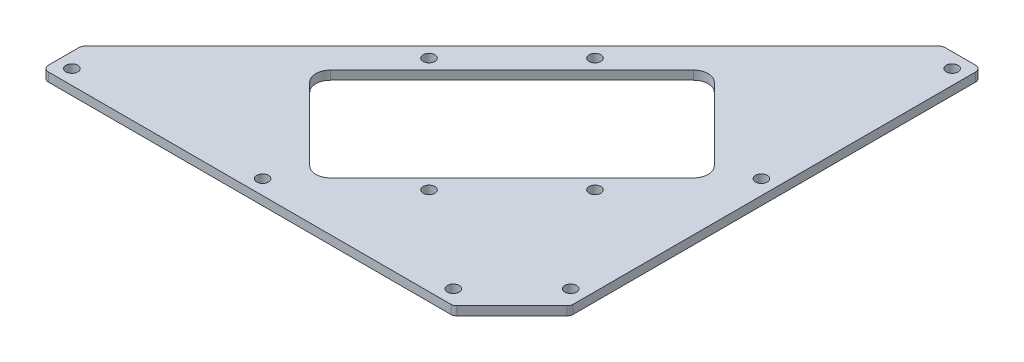
ISO-10303-21;
HEADER;
FILE_DESCRIPTION(('STEP AP214'),'2;1');
FILE_NAME('part.step','',(''),(''),'','','');
FILE_SCHEMA(('AUTOMOTIVE_DESIGN { 1 0 10303 214 1 1 1 1 }'));
ENDSEC;
DATA;
#1=APPLICATION_CONTEXT('core data for automotive mechanical design processes');
#2=APPLICATION_PROTOCOL_DEFINITION('international standard','automotive_design',2000,#1);
#3=PRODUCT_CONTEXT('',#1,'mechanical');
#4=PRODUCT('Part','Part','',(#3));
#5=PRODUCT_RELATED_PRODUCT_CATEGORY('part','',(#4));
#6=PRODUCT_DEFINITION_FORMATION('','',#4);
#7=PRODUCT_DEFINITION_CONTEXT('part definition',#1,'design');
#8=PRODUCT_DEFINITION('design','',#6,#7);
#9=PRODUCT_DEFINITION_SHAPE('','',#8);
#10=(LENGTH_UNIT() NAMED_UNIT(*) SI_UNIT(.MILLI.,.METRE.));
#11=(NAMED_UNIT(*) PLANE_ANGLE_UNIT() SI_UNIT($,.RADIAN.));
#12=(NAMED_UNIT(*) SI_UNIT($,.STERADIAN.) SOLID_ANGLE_UNIT());
#13=UNCERTAINTY_MEASURE_WITH_UNIT(LENGTH_MEASURE(1.E-05),#10,'distance_accuracy_value','');
#14=(GEOMETRIC_REPRESENTATION_CONTEXT(3) GLOBAL_UNCERTAINTY_ASSIGNED_CONTEXT((#13)) GLOBAL_UNIT_ASSIGNED_CONTEXT((#10,
#11,#12)) REPRESENTATION_CONTEXT('',''));
#15=CARTESIAN_POINT('',(0.,0.,0.));
#16=DIRECTION('',(0.,0.,1.));
#17=DIRECTION('',(1.,0.,0.));
#18=AXIS2_PLACEMENT_3D('',#15,#16,#17);
#19=CARTESIAN_POINT('',(-34.4714555828443,3.,34.4714555828442));
#20=DIRECTION('',(-0.707106781186548,0.,0.707106781186547));
#21=DIRECTION('',(0.707106781186547,0.,0.707106781186548));
#22=AXIS2_PLACEMENT_3D('',#19,#20,#21);
#23=PLANE('',#22);
#24=DIRECTION('',(-0.707106781186547,0.,-0.707106781186548));
#25=VECTOR('',#24,1.);
#26=CARTESIAN_POINT('',(-34.4714555828443,0.,34.4714555828442));
#27=LINE('',#26,#25);
#28=CARTESIAN_POINT('',(-85.7366972188688,0.,-16.7937860531805));
#29=VERTEX_POINT('',#28);
#30=CARTESIAN_POINT('',(-110.485434560398,0.,-41.5425233947097));
#31=VERTEX_POINT('',#30);
#32=EDGE_CURVE('E220',#29,#31,#27,.T.);
#33=ORIENTED_EDGE('',*,*,#32,.T.);
#34=DIRECTION('',(0.,-1.,0.));
#35=VECTOR('',#34,1.);
#36=CARTESIAN_POINT('',(-110.485434560398,3.,-41.5425233947097));
#37=LINE('',#36,#35);
#38=CARTESIAN_POINT('',(-110.485434560398,3.,-41.5425233947097));
#39=VERTEX_POINT('',#38);
#40=EDGE_CURVE('E306',#31,#39,#37,.F.);
#41=ORIENTED_EDGE('',*,*,#40,.T.);
#42=DIRECTION('',(-0.707106781186547,0.,-0.707106781186548));
#43=VECTOR('',#42,1.);
#44=CARTESIAN_POINT('',(-34.4714555828443,3.,34.4714555828442));
#45=LINE('',#44,#43);
#46=CARTESIAN_POINT('',(-85.7366972188688,3.,-16.7937860531805));
#47=VERTEX_POINT('',#46);
#48=EDGE_CURVE('E348',#47,#39,#45,.T.);
#49=ORIENTED_EDGE('',*,*,#48,.F.);
#50=DIRECTION('',(0.,-1.,0.));
#51=VECTOR('',#50,1.);
#52=CARTESIAN_POINT('',(-85.7366972188688,3.,-16.7937860531805));
#53=LINE('',#52,#51);
#54=EDGE_CURVE('E303',#47,#29,#53,.T.);
#55=ORIENTED_EDGE('',*,*,#54,.T.);
#56=EDGE_LOOP('',(#33,#41,#49,#55));
#57=FACE_BOUND('',#56,.T.);
#58=ADVANCED_FACE('F37',(#57),#23,.F.);
#59=CARTESIAN_POINT('',(-79.5495128834866,3.,-79.5495128834866));
#60=DIRECTION('',(-0.707106781186548,0.,-0.707106781186547));
#61=DIRECTION('',(-0.707106781186547,0.,0.707106781186548));
#62=AXIS2_PLACEMENT_3D('',#59,#60,#61);
#63=PLANE('',#62);
#64=DIRECTION('',(0.707106781186547,0.,-0.707106781186548));
#65=VECTOR('',#64,1.);
#66=CARTESIAN_POINT('',(-79.5495128834866,3.,-79.5495128834866));
#67=LINE('',#66,#65);
#68=CARTESIAN_POINT('',(-110.485434560398,3.,-48.6135912065752));
#69=VERTEX_POINT('',#68);
#70=CARTESIAN_POINT('',(-48.6135912065751,3.,-110.485434560398));
#71=VERTEX_POINT('',#70);
#72=EDGE_CURVE('E343',#69,#71,#67,.T.);
#73=ORIENTED_EDGE('',*,*,#72,.F.);
#74=DIRECTION('',(0.,-1.,0.));
#75=VECTOR('',#74,1.);
#76=CARTESIAN_POINT('',(-110.485434560398,0.,-48.6135912065752));
#77=LINE('',#76,#75);
#78=CARTESIAN_POINT('',(-110.485434560398,0.,-48.6135912065752));
#79=VERTEX_POINT('',#78);
#80=EDGE_CURVE('E300',#69,#79,#77,.T.);
#81=ORIENTED_EDGE('',*,*,#80,.T.);
#82=DIRECTION('',(0.707106781186547,0.,-0.707106781186548));
#83=VECTOR('',#82,1.);
#84=CARTESIAN_POINT('',(-79.5495128834866,0.,-79.5495128834866));
#85=LINE('',#84,#83);
#86=CARTESIAN_POINT('',(-48.6135912065751,0.,-110.485434560398));
#87=VERTEX_POINT('',#86);
#88=EDGE_CURVE('E223',#79,#87,#85,.T.);
#89=ORIENTED_EDGE('',*,*,#88,.T.);
#90=DIRECTION('',(0.,-1.,0.));
#91=VECTOR('',#90,1.);
#92=CARTESIAN_POINT('',(-48.6135912065751,3.,-110.485434560398));
#93=LINE('',#92,#91);
#94=EDGE_CURVE('E298',#87,#71,#93,.F.);
#95=ORIENTED_EDGE('',*,*,#94,.T.);
#96=EDGE_LOOP('',(#73,#81,#89,#95));
#97=FACE_BOUND('',#96,.T.);
#98=ADVANCED_FACE('F337',(#97),#63,.F.);
#99=CARTESIAN_POINT('',(34.4714555828442,3.,-34.4714555828443));
#100=DIRECTION('',(-0.707106781186547,0.,0.707106781186548));
#101=DIRECTION('',(0.707106781186548,0.,0.707106781186547));
#102=AXIS2_PLACEMENT_3D('',#99,#100,#101);
#103=PLANE('',#102);
#104=DIRECTION('',(-0.707106781186548,0.,-0.707106781186547));
#105=VECTOR('',#104,1.);
#106=CARTESIAN_POINT('',(34.4714555828442,0.,-34.4714555828443));
#107=LINE('',#106,#105);
#108=CARTESIAN_POINT('',(-16.7937860531805,0.,-85.7366972188689));
#109=VERTEX_POINT('',#108);
#110=CARTESIAN_POINT('',(-41.5425233947096,0.,-110.485434560398));
#111=VERTEX_POINT('',#110);
#112=EDGE_CURVE('E226',#109,#111,#107,.T.);
#113=ORIENTED_EDGE('',*,*,#112,.F.);
#114=DIRECTION('',(0.,-1.,0.));
#115=VECTOR('',#114,1.);
#116=CARTESIAN_POINT('',(-16.7937860531805,3.,-85.7366972188689));
#117=LINE('',#116,#115);
#118=CARTESIAN_POINT('',(-16.7937860531805,3.,-85.7366972188689));
#119=VERTEX_POINT('',#118);
#120=EDGE_CURVE('E57',#109,#119,#117,.F.);
#121=ORIENTED_EDGE('',*,*,#120,.T.);
#122=DIRECTION('',(-0.707106781186548,0.,-0.707106781186547));
#123=VECTOR('',#122,1.);
#124=CARTESIAN_POINT('',(34.4714555828442,3.,-34.4714555828443));
#125=LINE('',#124,#123);
#126=CARTESIAN_POINT('',(-41.5425233947096,3.,-110.485434560398));
#127=VERTEX_POINT('',#126);
#128=EDGE_CURVE('E340',#119,#127,#125,.T.);
#129=ORIENTED_EDGE('',*,*,#128,.T.);
#130=DIRECTION('',(0.,-1.,0.));
#131=VECTOR('',#130,1.);
#132=CARTESIAN_POINT('',(-41.5425233947096,3.,-110.485434560398));
#133=LINE('',#132,#131);
#134=EDGE_CURVE('E313',#127,#111,#133,.T.);
#135=ORIENTED_EDGE('',*,*,#134,.T.);
#136=EDGE_LOOP('',(#113,#121,#129,#135));
#137=FACE_BOUND('',#136,.T.);
#138=ADVANCED_FACE('F339',(#137),#103,.T.);
#139=CARTESIAN_POINT('',(-86.620580695352,3.,-86.620580695352));
#140=DIRECTION('',(-0.707106781186547,0.,-0.707106781186547));
#141=DIRECTION('',(-0.707106781186548,0.,0.707106781186548));
#142=AXIS2_PLACEMENT_3D('',#139,#140,#141);
#143=PLANE('',#142);
#144=DIRECTION('',(0.707106781186548,0.,-0.707106781186548));
#145=VECTOR('',#144,1.);
#146=CARTESIAN_POINT('',(-86.620580695352,3.,-86.620580695352));
#147=LINE('',#146,#145);
#148=CARTESIAN_POINT('',(-159.414213562373,3.,-13.826947828331));
#149=VERTEX_POINT('',#148);
#150=CARTESIAN_POINT('',(-13.826947828331,3.,-159.414213562373));
#151=VERTEX_POINT('',#150);
#152=EDGE_CURVE('E253',#149,#151,#147,.T.);
#153=ORIENTED_EDGE('',*,*,#152,.T.);
#154=DIRECTION('',(0.,-1.,0.));
#155=VECTOR('',#154,1.);
#156=CARTESIAN_POINT('',(-13.826947828331,0.,-159.414213562373));
#157=LINE('',#156,#155);
#158=CARTESIAN_POINT('',(-13.826947828331,0.,-159.414213562373));
#159=VERTEX_POINT('',#158);
#160=EDGE_CURVE('E285',#151,#159,#157,.T.);
#161=ORIENTED_EDGE('',*,*,#160,.T.);
#162=DIRECTION('',(0.707106781186548,0.,-0.707106781186548));
#163=VECTOR('',#162,1.);
#164=CARTESIAN_POINT('',(-86.620580695352,0.,-86.620580695352));
#165=LINE('',#164,#163);
#166=CARTESIAN_POINT('',(-159.414213562373,0.,-13.826947828331));
#167=VERTEX_POINT('',#166);
#168=EDGE_CURVE('E371',#167,#159,#165,.T.);
#169=ORIENTED_EDGE('',*,*,#168,.F.);
#170=DIRECTION('',(0.,-1.,0.));
#171=VECTOR('',#170,1.);
#172=CARTESIAN_POINT('',(-159.414213562373,3.,-13.826947828331));
#173=LINE('',#172,#171);
#174=EDGE_CURVE('E283',#167,#149,#173,.F.);
#175=ORIENTED_EDGE('',*,*,#174,.T.);
#176=EDGE_LOOP('',(#153,#161,#169,#175));
#177=FACE_BOUND('',#176,.T.);
#178=ADVANCED_FACE('F475',(#177),#143,.T.);
#179=CARTESIAN_POINT('',(-160.,3.,0.));
#180=DIRECTION('',(-1.,0.,0.));
#181=DIRECTION('',(0.,0.,1.));
#182=AXIS2_PLACEMENT_3D('',#179,#180,#181);
#183=PLANE('',#182);
#184=DIRECTION('',(0.,0.,-1.));
#185=VECTOR('',#184,1.);
#186=CARTESIAN_POINT('',(-160.,0.,0.));
#187=LINE('',#186,#185);
#188=CARTESIAN_POINT('',(-160.,0.,-2.00000000000006));
#189=VERTEX_POINT('',#188);
#190=CARTESIAN_POINT('',(-160.,0.,-12.4127342659579));
#191=VERTEX_POINT('',#190);
#192=EDGE_CURVE('E374',#189,#191,#187,.T.);
#193=ORIENTED_EDGE('',*,*,#192,.F.);
#194=DIRECTION('',(0.,-1.,0.));
#195=VECTOR('',#194,1.);
#196=CARTESIAN_POINT('',(-160.,3.,-2.00000000000006));
#197=LINE('',#196,#195);
#198=CARTESIAN_POINT('',(-160.,3.,-2.00000000000006));
#199=VERTEX_POINT('',#198);
#200=EDGE_CURVE('E296',#189,#199,#197,.F.);
#201=ORIENTED_EDGE('',*,*,#200,.T.);
#202=DIRECTION('',(0.,0.,-1.));
#203=VECTOR('',#202,1.);
#204=CARTESIAN_POINT('',(-160.,3.,0.));
#205=LINE('',#204,#203);
#206=CARTESIAN_POINT('',(-160.,3.,-12.4127342659579));
#207=VERTEX_POINT('',#206);
#208=EDGE_CURVE('E400',#199,#207,#205,.T.);
#209=ORIENTED_EDGE('',*,*,#208,.T.);
#210=DIRECTION('',(0.,-1.,0.));
#211=VECTOR('',#210,1.);
#212=CARTESIAN_POINT('',(-160.,3.,-12.4127342659579));
#213=LINE('',#212,#211);
#214=EDGE_CURVE('E293',#207,#191,#213,.T.);
#215=ORIENTED_EDGE('',*,*,#214,.T.);
#216=EDGE_LOOP('',(#193,#201,#209,#215));
#217=FACE_BOUND('',#216,.T.);
#218=ADVANCED_FACE('F472',(#217),#183,.T.);
#219=CARTESIAN_POINT('',(0.,3.,0.));
#220=DIRECTION('',(0.,0.,-1.));
#221=DIRECTION('',(-1.,0.,0.));
#222=AXIS2_PLACEMENT_3D('',#219,#220,#221);
#223=PLANE('',#222);
#224=DIRECTION('',(1.,0.,0.));
#225=VECTOR('',#224,1.);
#226=CARTESIAN_POINT('',(0.,0.,0.));
#227=LINE('',#226,#225);
#228=CARTESIAN_POINT('',(-158.,0.,0.));
#229=VERTEX_POINT('',#228);
#230=CARTESIAN_POINT('',(-20.8284271247462,0.,0.));
#231=VERTEX_POINT('',#230);
#232=EDGE_CURVE('E208',#229,#231,#227,.T.);
#233=ORIENTED_EDGE('',*,*,#232,.T.);
#234=DIRECTION('',(0.,-1.,0.));
#235=VECTOR('',#234,1.);
#236=CARTESIAN_POINT('',(-20.8284271247462,3.,0.));
#237=LINE('',#236,#235);
#238=CARTESIAN_POINT('',(-20.8284271247462,3.,0.));
#239=VERTEX_POINT('',#238);
#240=EDGE_CURVE('E281',#231,#239,#237,.F.);
#241=ORIENTED_EDGE('',*,*,#240,.T.);
#242=DIRECTION('',(1.,0.,0.));
#243=VECTOR('',#242,1.);
#244=CARTESIAN_POINT('',(0.,3.,0.));
#245=LINE('',#244,#243);
#246=CARTESIAN_POINT('',(-158.,3.,0.));
#247=VERTEX_POINT('',#246);
#248=EDGE_CURVE('E394',#247,#239,#245,.T.);
#249=ORIENTED_EDGE('',*,*,#248,.F.);
#250=DIRECTION('',(0.,-1.,0.));
#251=VECTOR('',#250,1.);
#252=CARTESIAN_POINT('',(-158.,0.,0.));
#253=LINE('',#252,#251);
#254=EDGE_CURVE('E278',#247,#229,#253,.T.);
#255=ORIENTED_EDGE('',*,*,#254,.T.);
#256=EDGE_LOOP('',(#233,#241,#249,#255));
#257=FACE_BOUND('',#256,.T.);
#258=ADVANCED_FACE('F380',(#257),#223,.F.);
#259=CARTESIAN_POINT('',(-10.,3.,-10.));
#260=DIRECTION('',(-0.707106781186547,0.,-0.707106781186547));
#261=DIRECTION('',(-0.707106781186548,0.,0.707106781186548));
#262=AXIS2_PLACEMENT_3D('',#259,#260,#261);
#263=PLANE('',#262);
#264=DIRECTION('',(0.707106781186548,0.,-0.707106781186548));
#265=VECTOR('',#264,1.);
#266=CARTESIAN_POINT('',(-10.,0.,-10.));
#267=LINE('',#266,#265);
#268=CARTESIAN_POINT('',(-19.4142135623731,0.,-0.585786437626914));
#269=VERTEX_POINT('',#268);
#270=CARTESIAN_POINT('',(-0.585786437626907,0.,-19.4142135623731));
#271=VERTEX_POINT('',#270);
#272=EDGE_CURVE('E203',#269,#271,#267,.T.);
#273=ORIENTED_EDGE('',*,*,#272,.T.);
#274=DIRECTION('',(0.,-1.,0.));
#275=VECTOR('',#274,1.);
#276=CARTESIAN_POINT('',(-0.585786437626908,3.,-19.4142135623731));
#277=LINE('',#276,#275);
#278=CARTESIAN_POINT('',(-0.585786437626907,3.,-19.4142135623731));
#279=VERTEX_POINT('',#278);
#280=EDGE_CURVE('E179',#271,#279,#277,.F.);
#281=ORIENTED_EDGE('',*,*,#280,.T.);
#282=DIRECTION('',(0.707106781186548,0.,-0.707106781186548));
#283=VECTOR('',#282,1.);
#284=CARTESIAN_POINT('',(-10.,3.,-10.));
#285=LINE('',#284,#283);
#286=CARTESIAN_POINT('',(-19.4142135623731,3.,-0.585786437626914));
#287=VERTEX_POINT('',#286);
#288=EDGE_CURVE('E393',#287,#279,#285,.T.);
#289=ORIENTED_EDGE('',*,*,#288,.F.);
#290=DIRECTION('',(0.,-1.,0.));
#291=VECTOR('',#290,1.);
#292=CARTESIAN_POINT('',(-19.4142135623731,3.,-0.585786437626915));
#293=LINE('',#292,#291);
#294=EDGE_CURVE('E184',#287,#269,#293,.T.);
#295=ORIENTED_EDGE('',*,*,#294,.T.);
#296=EDGE_LOOP('',(#273,#281,#289,#295));
#297=FACE_BOUND('',#296,.T.);
#298=ADVANCED_FACE('F396',(#297),#263,.F.);
#299=CARTESIAN_POINT('',(0.,3.,0.));
#300=DIRECTION('',(-1.,0.,0.));
#301=DIRECTION('',(0.,0.,1.));
#302=AXIS2_PLACEMENT_3D('',#299,#300,#301);
#303=PLANE('',#302);
#304=DIRECTION('',(0.,0.,-1.));
#305=VECTOR('',#304,1.);
#306=CARTESIAN_POINT('',(0.,3.,0.));
#307=LINE('',#306,#305);
#308=CARTESIAN_POINT('',(0.,3.,-20.8284271247462));
#309=VERTEX_POINT('',#308);
#310=CARTESIAN_POINT('',(0.,3.,-158.));
#311=VERTEX_POINT('',#310);
#312=EDGE_CURVE('E194',#309,#311,#307,.T.);
#313=ORIENTED_EDGE('',*,*,#312,.F.);
#314=DIRECTION('',(0.,-1.,0.));
#315=VECTOR('',#314,1.);
#316=CARTESIAN_POINT('',(0.,3.,-20.8284271247462));
#317=LINE('',#316,#315);
#318=CARTESIAN_POINT('',(0.,0.,-20.8284271247462));
#319=VERTEX_POINT('',#318);
#320=EDGE_CURVE('E178',#309,#319,#317,.T.);
#321=ORIENTED_EDGE('',*,*,#320,.T.);
#322=DIRECTION('',(0.,0.,-1.));
#323=VECTOR('',#322,1.);
#324=CARTESIAN_POINT('',(0.,0.,0.));
#325=LINE('',#324,#323);
#326=CARTESIAN_POINT('',(0.,0.,-158.));
#327=VERTEX_POINT('',#326);
#328=EDGE_CURVE('E191',#319,#327,#325,.T.);
#329=ORIENTED_EDGE('',*,*,#328,.T.);
#330=DIRECTION('',(0.,-1.,0.));
#331=VECTOR('',#330,1.);
#332=CARTESIAN_POINT('',(0.,3.,-158.));
#333=LINE('',#332,#331);
#334=EDGE_CURVE('E196',#327,#311,#333,.F.);
#335=ORIENTED_EDGE('',*,*,#334,.T.);
#336=EDGE_LOOP('',(#313,#321,#329,#335));
#337=FACE_BOUND('',#336,.T.);
#338=ADVANCED_FACE('F190',(#337),#303,.F.);
#339=CARTESIAN_POINT('',(-5.,3.,-155.));
#340=DIRECTION('',(0.,-1.,0.));
#341=DIRECTION('',(0.,0.,-1.));
#342=AXIS2_PLACEMENT_3D('',#339,#340,#341);
#343=CYLINDRICAL_SURFACE('',#342,2.);
#344=CARTESIAN_POINT('',(-5.,3.,-155.));
#345=DIRECTION('',(0.,1.,0.));
#346=DIRECTION('',(0.,0.,1.));
#347=AXIS2_PLACEMENT_3D('',#344,#345,#346);
#348=CIRCLE('',#347,2.);
#349=CARTESIAN_POINT('',(-5.,3.,-153.));
#350=VERTEX_POINT('',#349);
#351=EDGE_CURVE('E366',#350,#350,#348,.T.);
#352=ORIENTED_EDGE('',*,*,#351,.T.);
#353=EDGE_LOOP('',(#352));
#354=FACE_BOUND('',#353,.T.);
#355=CARTESIAN_POINT('',(-5.,0.,-155.));
#356=DIRECTION('',(0.,1.,0.));
#357=DIRECTION('',(0.,0.,1.));
#358=AXIS2_PLACEMENT_3D('',#355,#356,#357);
#359=CIRCLE('',#358,2.);
#360=CARTESIAN_POINT('',(-5.,0.,-153.));
#361=VERTEX_POINT('',#360);
#362=EDGE_CURVE('E247',#361,#361,#359,.T.);
#363=ORIENTED_EDGE('',*,*,#362,.F.);
#364=EDGE_LOOP('',(#363));
#365=FACE_BOUND('',#364,.T.);
#366=ADVANCED_FACE('F467',(#354,#365),#343,.F.);
#367=CARTESIAN_POINT('',(-30.0520382004283,3.,-58.3363094478902));
#368=DIRECTION('',(0.,-1.,0.));
#369=DIRECTION('',(0.,0.,-1.));
#370=AXIS2_PLACEMENT_3D('',#367,#368,#369);
#371=CYLINDRICAL_SURFACE('',#370,2.);
#372=CARTESIAN_POINT('',(-30.0520382004283,3.,-58.3363094478902));
#373=DIRECTION('',(0.,1.,0.));
#374=DIRECTION('',(0.,0.,1.));
#375=AXIS2_PLACEMENT_3D('',#372,#373,#374);
#376=CIRCLE('',#375,2.);
#377=CARTESIAN_POINT('',(-30.0520382004283,3.,-56.3363094478902));
#378=VERTEX_POINT('',#377);
#379=EDGE_CURVE('E363',#378,#378,#376,.F.);
#380=ORIENTED_EDGE('',*,*,#379,.F.);
#381=EDGE_LOOP('',(#380));
#382=FACE_BOUND('',#381,.T.);
#383=CARTESIAN_POINT('',(-30.0520382004283,0.,-58.3363094478902));
#384=DIRECTION('',(0.,1.,0.));
#385=DIRECTION('',(0.,0.,1.));
#386=AXIS2_PLACEMENT_3D('',#383,#384,#385);
#387=CIRCLE('',#386,2.);
#388=CARTESIAN_POINT('',(-30.0520382004283,0.,-56.3363094478902));
#389=VERTEX_POINT('',#388);
#390=EDGE_CURVE('E244',#389,#389,#387,.F.);
#391=ORIENTED_EDGE('',*,*,#390,.T.);
#392=EDGE_LOOP('',(#391));
#393=FACE_BOUND('',#392,.T.);
#394=ADVANCED_FACE('F703',(#382,#393),#371,.F.);
#395=CARTESIAN_POINT('',(-68.9429111656884,3.,-97.2271824131503));
#396=DIRECTION('',(0.,-1.,0.));
#397=DIRECTION('',(0.,0.,-1.));
#398=AXIS2_PLACEMENT_3D('',#395,#396,#397);
#399=CYLINDRICAL_SURFACE('',#398,2.);
#400=CARTESIAN_POINT('',(-68.9429111656884,3.,-97.2271824131503));
#401=DIRECTION('',(0.,1.,0.));
#402=DIRECTION('',(0.,0.,1.));
#403=AXIS2_PLACEMENT_3D('',#400,#401,#402);
#404=CIRCLE('',#403,2.);
#405=CARTESIAN_POINT('',(-68.9429111656884,3.,-95.2271824131503));
#406=VERTEX_POINT('',#405);
#407=EDGE_CURVE('E360',#406,#406,#404,.T.);
#408=ORIENTED_EDGE('',*,*,#407,.T.);
#409=EDGE_LOOP('',(#408));
#410=FACE_BOUND('',#409,.T.);
#411=CARTESIAN_POINT('',(-68.9429111656884,0.,-97.2271824131503));
#412=DIRECTION('',(0.,1.,0.));
#413=DIRECTION('',(0.,0.,1.));
#414=AXIS2_PLACEMENT_3D('',#411,#412,#413);
#415=CIRCLE('',#414,2.);
#416=CARTESIAN_POINT('',(-68.9429111656884,0.,-95.2271824131503));
#417=VERTEX_POINT('',#416);
#418=EDGE_CURVE('E241',#417,#417,#415,.T.);
#419=ORIENTED_EDGE('',*,*,#418,.F.);
#420=EDGE_LOOP('',(#419));
#421=FACE_BOUND('',#420,.T.);
#422=ADVANCED_FACE('F693',(#410,#421),#399,.F.);
#423=CARTESIAN_POINT('',(-90.,3.,-5.00000000000002));
#424=DIRECTION('',(0.,-1.,0.));
#425=DIRECTION('',(0.,0.,-1.));
#426=AXIS2_PLACEMENT_3D('',#423,#424,#425);
#427=CYLINDRICAL_SURFACE('',#426,2.);
#428=CARTESIAN_POINT('',(-90.,3.,-5.00000000000002));
#429=DIRECTION('',(0.,1.,0.));
#430=DIRECTION('',(0.,0.,1.));
#431=AXIS2_PLACEMENT_3D('',#428,#429,#430);
#432=CIRCLE('',#431,2.);
#433=CARTESIAN_POINT('',(-90.,3.,-3.00000000000002));
#434=VERTEX_POINT('',#433);
#435=EDGE_CURVE('E357',#434,#434,#432,.F.);
#436=ORIENTED_EDGE('',*,*,#435,.F.);
#437=EDGE_LOOP('',(#436));
#438=FACE_BOUND('',#437,.T.);
#439=CARTESIAN_POINT('',(-90.,0.,-5.00000000000002));
#440=DIRECTION('',(0.,1.,0.));
#441=DIRECTION('',(0.,0.,1.));
#442=AXIS2_PLACEMENT_3D('',#439,#440,#441);
#443=CIRCLE('',#442,2.);
#444=CARTESIAN_POINT('',(-90.,0.,-3.00000000000002));
#445=VERTEX_POINT('',#444);
#446=EDGE_CURVE('E238',#445,#445,#443,.F.);
#447=ORIENTED_EDGE('',*,*,#446,.T.);
#448=EDGE_LOOP('',(#447));
#449=FACE_BOUND('',#448,.T.);
#450=ADVANCED_FACE('F683',(#438,#449),#427,.F.);
#451=CARTESIAN_POINT('',(-5.,3.,-90.));
#452=DIRECTION('',(0.,-1.,0.));
#453=DIRECTION('',(0.,0.,-1.));
#454=AXIS2_PLACEMENT_3D('',#451,#452,#453);
#455=CYLINDRICAL_SURFACE('',#454,2.);
#456=CARTESIAN_POINT('',(-5.,3.,-90.));
#457=DIRECTION('',(0.,1.,0.));
#458=DIRECTION('',(0.,0.,1.));
#459=AXIS2_PLACEMENT_3D('',#456,#457,#458);
#460=CIRCLE('',#459,2.);
#461=CARTESIAN_POINT('',(-5.,3.,-88.));
#462=VERTEX_POINT('',#461);
#463=EDGE_CURVE('E354',#462,#462,#460,.T.);
#464=ORIENTED_EDGE('',*,*,#463,.T.);
#465=EDGE_LOOP('',(#464));
#466=FACE_BOUND('',#465,.T.);
#467=CARTESIAN_POINT('',(-5.,0.,-90.));
#468=DIRECTION('',(0.,1.,0.));
#469=DIRECTION('',(0.,0.,1.));
#470=AXIS2_PLACEMENT_3D('',#467,#468,#469);
#471=CIRCLE('',#470,2.);
#472=CARTESIAN_POINT('',(-5.,0.,-88.));
#473=VERTEX_POINT('',#472);
#474=EDGE_CURVE('E235',#473,#473,#471,.T.);
#475=ORIENTED_EDGE('',*,*,#474,.F.);
#476=EDGE_LOOP('',(#475));
#477=FACE_BOUND('',#476,.T.);
#478=ADVANCED_FACE('F675',(#466,#477),#455,.F.);
#479=CARTESIAN_POINT('',(-5.,3.,-25.));
#480=DIRECTION('',(0.,-1.,0.));
#481=DIRECTION('',(0.,0.,-1.));
#482=AXIS2_PLACEMENT_3D('',#479,#480,#481);
#483=CYLINDRICAL_SURFACE('',#482,2.);
#484=CARTESIAN_POINT('',(-5.,3.,-25.));
#485=DIRECTION('',(0.,1.,0.));
#486=DIRECTION('',(0.,0.,1.));
#487=AXIS2_PLACEMENT_3D('',#484,#485,#486);
#488=CIRCLE('',#487,2.);
#489=CARTESIAN_POINT('',(-5.,3.,-23.));
#490=VERTEX_POINT('',#489);
#491=EDGE_CURVE('E346',#490,#490,#488,.T.);
#492=ORIENTED_EDGE('',*,*,#491,.T.);
#493=EDGE_LOOP('',(#492));
#494=FACE_BOUND('',#493,.T.);
#495=CARTESIAN_POINT('',(-5.,0.,-25.));
#496=DIRECTION('',(0.,1.,0.));
#497=DIRECTION('',(0.,0.,1.));
#498=AXIS2_PLACEMENT_3D('',#495,#496,#497);
#499=CIRCLE('',#498,2.);
#500=CARTESIAN_POINT('',(-5.,0.,-23.));
#501=VERTEX_POINT('',#500);
#502=EDGE_CURVE('E232',#501,#501,#499,.T.);
#503=ORIENTED_EDGE('',*,*,#502,.F.);
#504=EDGE_LOOP('',(#503));
#505=FACE_BOUND('',#504,.T.);
#506=ADVANCED_FACE('F647',(#494,#505),#483,.F.);
#507=CARTESIAN_POINT('',(-47.7297077300919,3.,-47.7297077300919));
#508=DIRECTION('',(-0.707106781186548,0.,-0.707106781186547));
#509=DIRECTION('',(-0.707106781186547,0.,0.707106781186548));
#510=AXIS2_PLACEMENT_3D('',#507,#508,#509);
#511=PLANE('',#510);
#512=DIRECTION('',(0.707106781186547,0.,-0.707106781186548));
#513=VECTOR('',#512,1.);
#514=CARTESIAN_POINT('',(-47.7297077300919,0.,-47.7297077300919));
#515=LINE('',#514,#513);
#516=CARTESIAN_POINT('',(-78.6656294070034,0.,-16.7937860531805));
#517=VERTEX_POINT('',#516);
#518=CARTESIAN_POINT('',(-16.7937860531805,0.,-78.6656294070034));
#519=VERTEX_POINT('',#518);
#520=EDGE_CURVE('E229',#517,#519,#515,.T.);
#521=ORIENTED_EDGE('',*,*,#520,.F.);
#522=DIRECTION('',(0.,-1.,0.));
#523=VECTOR('',#522,1.);
#524=CARTESIAN_POINT('',(-78.6656294070034,3.,-16.7937860531805));
#525=LINE('',#524,#523);
#526=CARTESIAN_POINT('',(-78.6656294070034,3.,-16.7937860531805));
#527=VERTEX_POINT('',#526);
#528=EDGE_CURVE('E311',#517,#527,#525,.F.);
#529=ORIENTED_EDGE('',*,*,#528,.T.);
#530=DIRECTION('',(0.707106781186547,0.,-0.707106781186548));
#531=VECTOR('',#530,1.);
#532=CARTESIAN_POINT('',(-47.7297077300919,3.,-47.7297077300919));
#533=LINE('',#532,#531);
#534=CARTESIAN_POINT('',(-16.7937860531805,3.,-78.6656294070034));
#535=VERTEX_POINT('',#534);
#536=EDGE_CURVE('E342',#527,#535,#533,.T.);
#537=ORIENTED_EDGE('',*,*,#536,.T.);
#538=DIRECTION('',(0.,-1.,0.));
#539=VECTOR('',#538,1.);
#540=CARTESIAN_POINT('',(-16.7937860531805,0.,-78.6656294070034));
#541=LINE('',#540,#539);
#542=EDGE_CURVE('E308',#535,#519,#541,.T.);
#543=ORIENTED_EDGE('',*,*,#542,.T.);
#544=EDGE_LOOP('',(#521,#529,#537,#543));
#545=FACE_BOUND('',#544,.T.);
#546=ADVANCED_FACE('F430',(#545),#511,.T.);
#547=CARTESIAN_POINT('',(-25.,3.,-5.));
#548=DIRECTION('',(0.,-1.,0.));
#549=DIRECTION('',(0.,0.,-1.));
#550=AXIS2_PLACEMENT_3D('',#547,#548,#549);
#551=CYLINDRICAL_SURFACE('',#550,2.);
#552=CARTESIAN_POINT('',(-25.,3.,-5.));
#553=DIRECTION('',(0.,1.,0.));
#554=DIRECTION('',(0.,0.,1.));
#555=AXIS2_PLACEMENT_3D('',#552,#553,#554);
#556=CIRCLE('',#555,2.);
#557=CARTESIAN_POINT('',(-25.,3.,-3.));
#558=VERTEX_POINT('',#557);
#559=EDGE_CURVE('E412',#558,#558,#556,.F.);
#560=ORIENTED_EDGE('',*,*,#559,.F.);
#561=EDGE_LOOP('',(#560));
#562=FACE_BOUND('',#561,.T.);
#563=CARTESIAN_POINT('',(-25.,0.,-5.));
#564=DIRECTION('',(0.,1.,0.));
#565=DIRECTION('',(0.,0.,1.));
#566=AXIS2_PLACEMENT_3D('',#563,#564,#565);
#567=CIRCLE('',#566,2.);
#568=CARTESIAN_POINT('',(-25.,0.,-3.));
#569=VERTEX_POINT('',#568);
#570=EDGE_CURVE('E217',#569,#569,#567,.F.);
#571=ORIENTED_EDGE('',*,*,#570,.T.);
#572=EDGE_LOOP('',(#571));
#573=FACE_BOUND('',#572,.T.);
#574=ADVANCED_FACE('F448',(#562,#573),#551,.F.);
#575=CARTESIAN_POINT('',(-58.3363094478902,3.,-30.0520382004283));
#576=DIRECTION('',(0.,-1.,0.));
#577=DIRECTION('',(0.,0.,-1.));
#578=AXIS2_PLACEMENT_3D('',#575,#576,#577);
#579=CYLINDRICAL_SURFACE('',#578,2.);
#580=CARTESIAN_POINT('',(-58.3363094478902,3.,-30.0520382004283));
#581=DIRECTION('',(0.,1.,0.));
#582=DIRECTION('',(0.,0.,1.));
#583=AXIS2_PLACEMENT_3D('',#580,#581,#582);
#584=CIRCLE('',#583,2.);
#585=CARTESIAN_POINT('',(-58.3363094478902,3.,-28.0520382004283));
#586=VERTEX_POINT('',#585);
#587=EDGE_CURVE('E409',#586,#586,#584,.T.);
#588=ORIENTED_EDGE('',*,*,#587,.T.);
#589=EDGE_LOOP('',(#588));
#590=FACE_BOUND('',#589,.T.);
#591=CARTESIAN_POINT('',(-58.3363094478902,0.,-30.0520382004283));
#592=DIRECTION('',(0.,1.,0.));
#593=DIRECTION('',(0.,0.,1.));
#594=AXIS2_PLACEMENT_3D('',#591,#592,#593);
#595=CIRCLE('',#594,2.);
#596=CARTESIAN_POINT('',(-58.3363094478902,0.,-28.0520382004283));
#597=VERTEX_POINT('',#596);
#598=EDGE_CURVE('E214',#597,#597,#595,.T.);
#599=ORIENTED_EDGE('',*,*,#598,.F.);
#600=EDGE_LOOP('',(#599));
#601=FACE_BOUND('',#600,.T.);
#602=ADVANCED_FACE('F451',(#590,#601),#579,.F.);
#603=CARTESIAN_POINT('',(-97.2271824131503,3.,-68.9429111656884));
#604=DIRECTION('',(0.,-1.,0.));
#605=DIRECTION('',(0.,0.,-1.));
#606=AXIS2_PLACEMENT_3D('',#603,#604,#605);
#607=CYLINDRICAL_SURFACE('',#606,2.);
#608=CARTESIAN_POINT('',(-97.2271824131503,3.,-68.9429111656884));
#609=DIRECTION('',(0.,1.,0.));
#610=DIRECTION('',(0.,0.,1.));
#611=AXIS2_PLACEMENT_3D('',#608,#609,#610);
#612=CIRCLE('',#611,2.);
#613=CARTESIAN_POINT('',(-97.2271824131503,3.,-66.9429111656884));
#614=VERTEX_POINT('',#613);
#615=EDGE_CURVE('E406',#614,#614,#612,.F.);
#616=ORIENTED_EDGE('',*,*,#615,.F.);
#617=EDGE_LOOP('',(#616));
#618=FACE_BOUND('',#617,.T.);
#619=CARTESIAN_POINT('',(-97.2271824131503,0.,-68.9429111656884));
#620=DIRECTION('',(0.,1.,0.));
#621=DIRECTION('',(0.,0.,1.));
#622=AXIS2_PLACEMENT_3D('',#619,#620,#621);
#623=CIRCLE('',#622,2.);
#624=CARTESIAN_POINT('',(-97.2271824131503,0.,-66.9429111656884));
#625=VERTEX_POINT('',#624);
#626=EDGE_CURVE('E206',#625,#625,#623,.F.);
#627=ORIENTED_EDGE('',*,*,#626,.T.);
#628=EDGE_LOOP('',(#627));
#629=FACE_BOUND('',#628,.T.);
#630=ADVANCED_FACE('F455',(#618,#629),#607,.F.);
#631=CARTESIAN_POINT('',(0.,3.,-160.));
#632=DIRECTION('',(0.,0.,1.));
#633=DIRECTION('',(1.,0.,0.));
#634=AXIS2_PLACEMENT_3D('',#631,#632,#633);
#635=PLANE('',#634);
#636=DIRECTION('',(-1.,0.,0.));
#637=VECTOR('',#636,1.);
#638=CARTESIAN_POINT('',(0.,0.,-160.));
#639=LINE('',#638,#637);
#640=CARTESIAN_POINT('',(-2.00000000000003,0.,-160.));
#641=VERTEX_POINT('',#640);
#642=CARTESIAN_POINT('',(-12.4127342659579,0.,-160.));
#643=VERTEX_POINT('',#642);
#644=EDGE_CURVE('E202',#641,#643,#639,.T.);
#645=ORIENTED_EDGE('',*,*,#644,.T.);
#646=DIRECTION('',(0.,-1.,0.));
#647=VECTOR('',#646,1.);
#648=CARTESIAN_POINT('',(-12.4127342659579,3.,-160.));
#649=LINE('',#648,#647);
#650=CARTESIAN_POINT('',(-12.4127342659579,3.,-160.));
#651=VERTEX_POINT('',#650);
#652=EDGE_CURVE('E291',#643,#651,#649,.F.);
#653=ORIENTED_EDGE('',*,*,#652,.T.);
#654=DIRECTION('',(-1.,0.,0.));
#655=VECTOR('',#654,1.);
#656=CARTESIAN_POINT('',(0.,3.,-160.));
#657=LINE('',#656,#655);
#658=CARTESIAN_POINT('',(-2.00000000000003,3.,-160.));
#659=VERTEX_POINT('',#658);
#660=EDGE_CURVE('E398',#659,#651,#657,.T.);
#661=ORIENTED_EDGE('',*,*,#660,.F.);
#662=DIRECTION('',(0.,-1.,0.));
#663=VECTOR('',#662,1.);
#664=CARTESIAN_POINT('',(-2.00000000000003,3.,-160.));
#665=LINE('',#664,#663);
#666=EDGE_CURVE('E288',#659,#641,#665,.T.);
#667=ORIENTED_EDGE('',*,*,#666,.T.);
#668=EDGE_LOOP('',(#645,#653,#661,#667));
#669=FACE_BOUND('',#668,.T.);
#670=ADVANCED_FACE('F459',(#669),#635,.F.);
#671=CARTESIAN_POINT('',(-155.,3.,-4.99999999999992));
#672=DIRECTION('',(0.,-1.,0.));
#673=DIRECTION('',(0.,0.,-1.));
#674=AXIS2_PLACEMENT_3D('',#671,#672,#673);
#675=CYLINDRICAL_SURFACE('',#674,2.);
#676=CARTESIAN_POINT('',(-155.,3.,-4.99999999999992));
#677=DIRECTION('',(0.,1.,0.));
#678=DIRECTION('',(0.,0.,1.));
#679=AXIS2_PLACEMENT_3D('',#676,#677,#678);
#680=CIRCLE('',#679,2.);
#681=CARTESIAN_POINT('',(-155.,3.,-2.99999999999992));
#682=VERTEX_POINT('',#681);
#683=EDGE_CURVE('E254',#682,#682,#680,.F.);
#684=ORIENTED_EDGE('',*,*,#683,.F.);
#685=EDGE_LOOP('',(#684));
#686=FACE_BOUND('',#685,.T.);
#687=CARTESIAN_POINT('',(-155.,0.,-4.99999999999992));
#688=DIRECTION('',(0.,1.,0.));
#689=DIRECTION('',(0.,0.,1.));
#690=AXIS2_PLACEMENT_3D('',#687,#688,#689);
#691=CIRCLE('',#690,2.);
#692=CARTESIAN_POINT('',(-155.,0.,-2.99999999999992));
#693=VERTEX_POINT('',#692);
#694=EDGE_CURVE('E250',#693,#693,#691,.F.);
#695=ORIENTED_EDGE('',*,*,#694,.T.);
#696=EDGE_LOOP('',(#695));
#697=FACE_BOUND('',#696,.T.);
#698=ADVANCED_FACE('F463',(#686,#697),#675,.F.);
#699=CARTESIAN_POINT('',(0.,3.,0.));
#700=DIRECTION('',(0.,1.,0.));
#701=DIRECTION('',(0.,0.,1.));
#702=AXIS2_PLACEMENT_3D('',#699,#700,#701);
#703=PLANE('',#702);
#704=ORIENTED_EDGE('',*,*,#288,.T.);
#705=CARTESIAN_POINT('',(-2.,3.,-20.8284271247462));
#706=DIRECTION('',(0.,1.,0.));
#707=DIRECTION('',(0.,0.,1.));
#708=AXIS2_PLACEMENT_3D('',#705,#706,#707);
#709=CIRCLE('',#708,2.);
#710=EDGE_CURVE('E276',#279,#309,#709,.T.);
#711=ORIENTED_EDGE('',*,*,#710,.T.);
#712=ORIENTED_EDGE('',*,*,#312,.T.);
#713=CARTESIAN_POINT('',(-2.00000000000003,3.,-158.));
#714=DIRECTION('',(0.,1.,0.));
#715=DIRECTION('',(0.,0.,1.));
#716=AXIS2_PLACEMENT_3D('',#713,#714,#715);
#717=CIRCLE('',#716,2.);
#718=EDGE_CURVE('E270',#311,#659,#717,.T.);
#719=ORIENTED_EDGE('',*,*,#718,.T.);
#720=ORIENTED_EDGE('',*,*,#660,.T.);
#721=CARTESIAN_POINT('',(-12.4127342659579,3.,-158.));
#722=DIRECTION('',(0.,1.,0.));
#723=DIRECTION('',(0.,0.,1.));
#724=AXIS2_PLACEMENT_3D('',#721,#722,#723);
#725=CIRCLE('',#724,2.);
#726=EDGE_CURVE('E272',#651,#151,#725,.T.);
#727=ORIENTED_EDGE('',*,*,#726,.T.);
#728=ORIENTED_EDGE('',*,*,#152,.F.);
#729=CARTESIAN_POINT('',(-158.,3.,-12.4127342659579));
#730=DIRECTION('',(0.,1.,0.));
#731=DIRECTION('',(0.,0.,1.));
#732=AXIS2_PLACEMENT_3D('',#729,#730,#731);
#733=CIRCLE('',#732,2.);
#734=EDGE_CURVE('E266',#149,#207,#733,.T.);
#735=ORIENTED_EDGE('',*,*,#734,.T.);
#736=ORIENTED_EDGE('',*,*,#208,.F.);
#737=CARTESIAN_POINT('',(-158.,3.,-2.00000000000006));
#738=DIRECTION('',(0.,1.,0.));
#739=DIRECTION('',(0.,0.,1.));
#740=AXIS2_PLACEMENT_3D('',#737,#738,#739);
#741=CIRCLE('',#740,2.);
#742=EDGE_CURVE('E268',#199,#247,#741,.T.);
#743=ORIENTED_EDGE('',*,*,#742,.T.);
#744=ORIENTED_EDGE('',*,*,#248,.T.);
#745=CARTESIAN_POINT('',(-20.8284271247462,3.,-2.00000000000001));
#746=DIRECTION('',(0.,1.,0.));
#747=DIRECTION('',(0.,0.,1.));
#748=AXIS2_PLACEMENT_3D('',#745,#746,#747);
#749=CIRCLE('',#748,2.);
#750=EDGE_CURVE('E274',#239,#287,#749,.T.);
#751=ORIENTED_EDGE('',*,*,#750,.T.);
#752=EDGE_LOOP('',(#704,#711,#712,#719,#720,#727,#728,#735,#736,#743,#744,#751));
#753=FACE_BOUND('',#752,.T.);
#754=ORIENTED_EDGE('',*,*,#615,.T.);
#755=EDGE_LOOP('',(#754));
#756=FACE_BOUND('',#755,.T.);
#757=ORIENTED_EDGE('',*,*,#587,.F.);
#758=EDGE_LOOP('',(#757));
#759=FACE_BOUND('',#758,.T.);
#760=ORIENTED_EDGE('',*,*,#559,.T.);
#761=EDGE_LOOP('',(#760));
#762=FACE_BOUND('',#761,.T.);
#763=ORIENTED_EDGE('',*,*,#536,.F.);
#764=CARTESIAN_POINT('',(-82.2011633129361,3.,-20.3293199591132));
#765=DIRECTION('',(0.,1.,0.));
#766=DIRECTION('',(0.,0.,1.));
#767=AXIS2_PLACEMENT_3D('',#764,#765,#766);
#768=CIRCLE('',#767,5.);
#769=EDGE_CURVE('E323',#527,#47,#768,.F.);
#770=ORIENTED_EDGE('',*,*,#769,.T.);
#771=ORIENTED_EDGE('',*,*,#48,.T.);
#772=CARTESIAN_POINT('',(-106.949900654465,3.,-45.0780573006424));
#773=DIRECTION('',(0.,1.,0.));
#774=DIRECTION('',(0.,0.,1.));
#775=AXIS2_PLACEMENT_3D('',#772,#773,#774);
#776=CIRCLE('',#775,5.);
#777=EDGE_CURVE('E319',#39,#69,#776,.F.);
#778=ORIENTED_EDGE('',*,*,#777,.T.);
#779=ORIENTED_EDGE('',*,*,#72,.T.);
#780=CARTESIAN_POINT('',(-45.0780573006424,3.,-106.949900654465));
#781=DIRECTION('',(0.,1.,0.));
#782=DIRECTION('',(0.,0.,1.));
#783=AXIS2_PLACEMENT_3D('',#780,#781,#782);
#784=CIRCLE('',#783,5.);
#785=EDGE_CURVE('E11',#71,#127,#784,.F.);
#786=ORIENTED_EDGE('',*,*,#785,.T.);
#787=ORIENTED_EDGE('',*,*,#128,.F.);
#788=CARTESIAN_POINT('',(-20.3293199591132,3.,-82.2011633129361));
#789=DIRECTION('',(0.,1.,0.));
#790=DIRECTION('',(0.,0.,1.));
#791=AXIS2_PLACEMENT_3D('',#788,#789,#790);
#792=CIRCLE('',#791,5.);
#793=EDGE_CURVE('E327',#119,#535,#792,.F.);
#794=ORIENTED_EDGE('',*,*,#793,.T.);
#795=EDGE_LOOP('',(#763,#770,#771,#778,#779,#786,#787,#794));
#796=FACE_BOUND('',#795,.T.);
#797=ORIENTED_EDGE('',*,*,#491,.F.);
#798=EDGE_LOOP('',(#797));
#799=FACE_BOUND('',#798,.T.);
#800=ORIENTED_EDGE('',*,*,#463,.F.);
#801=EDGE_LOOP('',(#800));
#802=FACE_BOUND('',#801,.T.);
#803=ORIENTED_EDGE('',*,*,#435,.T.);
#804=EDGE_LOOP('',(#803));
#805=FACE_BOUND('',#804,.T.);
#806=ORIENTED_EDGE('',*,*,#407,.F.);
#807=EDGE_LOOP('',(#806));
#808=FACE_BOUND('',#807,.T.);
#809=ORIENTED_EDGE('',*,*,#379,.T.);
#810=EDGE_LOOP('',(#809));
#811=FACE_BOUND('',#810,.T.);
#812=ORIENTED_EDGE('',*,*,#351,.F.);
#813=EDGE_LOOP('',(#812));
#814=FACE_BOUND('',#813,.T.);
#815=ORIENTED_EDGE('',*,*,#683,.T.);
#816=EDGE_LOOP('',(#815));
#817=FACE_BOUND('',#816,.T.);
#818=ADVANCED_FACE('F391',(#753,#756,#759,#762,#796,#799,#802,#805,#808,#811,#814,#817),#703,.T.);
#819=CARTESIAN_POINT('',(0.,0.,0.));
#820=DIRECTION('',(0.,1.,0.));
#821=DIRECTION('',(0.,0.,1.));
#822=AXIS2_PLACEMENT_3D('',#819,#820,#821);
#823=PLANE('',#822);
#824=ORIENTED_EDGE('',*,*,#328,.F.);
#825=CARTESIAN_POINT('',(-2.,0.,-20.8284271247462));
#826=DIRECTION('',(0.,1.,0.));
#827=DIRECTION('',(0.,0.,1.));
#828=AXIS2_PLACEMENT_3D('',#825,#826,#827);
#829=CIRCLE('',#828,2.);
#830=EDGE_CURVE('E174',#319,#271,#829,.F.);
#831=ORIENTED_EDGE('',*,*,#830,.T.);
#832=ORIENTED_EDGE('',*,*,#272,.F.);
#833=CARTESIAN_POINT('',(-20.8284271247462,0.,-2.00000000000001));
#834=DIRECTION('',(0.,1.,0.));
#835=DIRECTION('',(0.,0.,1.));
#836=AXIS2_PLACEMENT_3D('',#833,#834,#835);
#837=CIRCLE('',#836,2.);
#838=EDGE_CURVE('E185',#269,#231,#837,.F.);
#839=ORIENTED_EDGE('',*,*,#838,.T.);
#840=ORIENTED_EDGE('',*,*,#232,.F.);
#841=CARTESIAN_POINT('',(-158.,0.,-2.00000000000006));
#842=DIRECTION('',(0.,1.,0.));
#843=DIRECTION('',(0.,0.,1.));
#844=AXIS2_PLACEMENT_3D('',#841,#842,#843);
#845=CIRCLE('',#844,2.);
#846=EDGE_CURVE('E257',#229,#189,#845,.F.);
#847=ORIENTED_EDGE('',*,*,#846,.T.);
#848=ORIENTED_EDGE('',*,*,#192,.T.);
#849=CARTESIAN_POINT('',(-158.,0.,-12.4127342659579));
#850=DIRECTION('',(0.,1.,0.));
#851=DIRECTION('',(0.,0.,1.));
#852=AXIS2_PLACEMENT_3D('',#849,#850,#851);
#853=CIRCLE('',#852,2.);
#854=EDGE_CURVE('E195',#191,#167,#853,.F.);
#855=ORIENTED_EDGE('',*,*,#854,.T.);
#856=ORIENTED_EDGE('',*,*,#168,.T.);
#857=CARTESIAN_POINT('',(-12.4127342659579,0.,-158.));
#858=DIRECTION('',(0.,1.,0.));
#859=DIRECTION('',(0.,0.,1.));
#860=AXIS2_PLACEMENT_3D('',#857,#858,#859);
#861=CIRCLE('',#860,2.);
#862=EDGE_CURVE('E260',#159,#643,#861,.F.);
#863=ORIENTED_EDGE('',*,*,#862,.T.);
#864=ORIENTED_EDGE('',*,*,#644,.F.);
#865=CARTESIAN_POINT('',(-2.00000000000003,0.,-158.));
#866=DIRECTION('',(0.,1.,0.));
#867=DIRECTION('',(0.,0.,1.));
#868=AXIS2_PLACEMENT_3D('',#865,#866,#867);
#869=CIRCLE('',#868,2.);
#870=EDGE_CURVE('E201',#641,#327,#869,.F.);
#871=ORIENTED_EDGE('',*,*,#870,.T.);
#872=EDGE_LOOP('',(#824,#831,#832,#839,#840,#847,#848,#855,#856,#863,#864,#871));
#873=FACE_BOUND('',#872,.T.);
#874=ORIENTED_EDGE('',*,*,#626,.F.);
#875=EDGE_LOOP('',(#874));
#876=FACE_BOUND('',#875,.T.);
#877=ORIENTED_EDGE('',*,*,#598,.T.);
#878=EDGE_LOOP('',(#877));
#879=FACE_BOUND('',#878,.T.);
#880=ORIENTED_EDGE('',*,*,#570,.F.);
#881=EDGE_LOOP('',(#880));
#882=FACE_BOUND('',#881,.T.);
#883=ORIENTED_EDGE('',*,*,#32,.F.);
#884=CARTESIAN_POINT('',(-82.2011633129361,0.,-20.3293199591132));
#885=DIRECTION('',(0.,1.,0.));
#886=DIRECTION('',(0.,0.,1.));
#887=AXIS2_PLACEMENT_3D('',#884,#885,#886);
#888=CIRCLE('',#887,5.);
#889=EDGE_CURVE('E321',#29,#517,#888,.T.);
#890=ORIENTED_EDGE('',*,*,#889,.T.);
#891=ORIENTED_EDGE('',*,*,#520,.T.);
#892=CARTESIAN_POINT('',(-20.3293199591132,0.,-82.2011633129361));
#893=DIRECTION('',(0.,1.,0.));
#894=DIRECTION('',(0.,0.,1.));
#895=AXIS2_PLACEMENT_3D('',#892,#893,#894);
#896=CIRCLE('',#895,5.);
#897=EDGE_CURVE('E325',#519,#109,#896,.T.);
#898=ORIENTED_EDGE('',*,*,#897,.T.);
#899=ORIENTED_EDGE('',*,*,#112,.T.);
#900=CARTESIAN_POINT('',(-45.0780573006424,0.,-106.949900654465));
#901=DIRECTION('',(0.,1.,0.));
#902=DIRECTION('',(0.,0.,1.));
#903=AXIS2_PLACEMENT_3D('',#900,#901,#902);
#904=CIRCLE('',#903,5.);
#905=EDGE_CURVE('E45',#111,#87,#904,.T.);
#906=ORIENTED_EDGE('',*,*,#905,.T.);
#907=ORIENTED_EDGE('',*,*,#88,.F.);
#908=CARTESIAN_POINT('',(-106.949900654465,0.,-45.0780573006424));
#909=DIRECTION('',(0.,1.,0.));
#910=DIRECTION('',(0.,0.,1.));
#911=AXIS2_PLACEMENT_3D('',#908,#909,#910);
#912=CIRCLE('',#911,5.);
#913=EDGE_CURVE('E317',#79,#31,#912,.T.);
#914=ORIENTED_EDGE('',*,*,#913,.T.);
#915=EDGE_LOOP('',(#883,#890,#891,#898,#899,#906,#907,#914));
#916=FACE_BOUND('',#915,.T.);
#917=ORIENTED_EDGE('',*,*,#502,.T.);
#918=EDGE_LOOP('',(#917));
#919=FACE_BOUND('',#918,.T.);
#920=ORIENTED_EDGE('',*,*,#474,.T.);
#921=EDGE_LOOP('',(#920));
#922=FACE_BOUND('',#921,.T.);
#923=ORIENTED_EDGE('',*,*,#446,.F.);
#924=EDGE_LOOP('',(#923));
#925=FACE_BOUND('',#924,.T.);
#926=ORIENTED_EDGE('',*,*,#418,.T.);
#927=EDGE_LOOP('',(#926));
#928=FACE_BOUND('',#927,.T.);
#929=ORIENTED_EDGE('',*,*,#390,.F.);
#930=EDGE_LOOP('',(#929));
#931=FACE_BOUND('',#930,.T.);
#932=ORIENTED_EDGE('',*,*,#362,.T.);
#933=EDGE_LOOP('',(#932));
#934=FACE_BOUND('',#933,.T.);
#935=ORIENTED_EDGE('',*,*,#694,.F.);
#936=EDGE_LOOP('',(#935));
#937=FACE_BOUND('',#936,.T.);
#938=ADVANCED_FACE('F198',(#873,#876,#879,#882,#916,#919,#922,#925,#928,#931,#934,#937),#823,.F.);
#939=CARTESIAN_POINT('',(-2.,3.,-20.8284271247462));
#940=DIRECTION('',(0.,-1.,0.));
#941=DIRECTION('',(0.,0.,-1.));
#942=AXIS2_PLACEMENT_3D('',#939,#940,#941);
#943=CYLINDRICAL_SURFACE('',#942,2.);
#944=ORIENTED_EDGE('',*,*,#710,.F.);
#945=ORIENTED_EDGE('',*,*,#280,.F.);
#946=ORIENTED_EDGE('',*,*,#830,.F.);
#947=ORIENTED_EDGE('',*,*,#320,.F.);
#948=EDGE_LOOP('',(#944,#945,#946,#947));
#949=FACE_BOUND('',#948,.T.);
#950=ADVANCED_FACE('F177',(#949),#943,.T.);
#951=CARTESIAN_POINT('',(-20.8284271247462,3.,-2.00000000000001));
#952=DIRECTION('',(0.,-1.,0.));
#953=DIRECTION('',(0.,0.,-1.));
#954=AXIS2_PLACEMENT_3D('',#951,#952,#953);
#955=CYLINDRICAL_SURFACE('',#954,2.);
#956=ORIENTED_EDGE('',*,*,#750,.F.);
#957=ORIENTED_EDGE('',*,*,#240,.F.);
#958=ORIENTED_EDGE('',*,*,#838,.F.);
#959=ORIENTED_EDGE('',*,*,#294,.F.);
#960=EDGE_LOOP('',(#956,#957,#958,#959));
#961=FACE_BOUND('',#960,.T.);
#962=ADVANCED_FACE('F386',(#961),#955,.T.);
#963=CARTESIAN_POINT('',(-12.4127342659579,3.,-158.));
#964=DIRECTION('',(0.,1.,0.));
#965=DIRECTION('',(0.,0.,1.));
#966=AXIS2_PLACEMENT_3D('',#963,#964,#965);
#967=CYLINDRICAL_SURFACE('',#966,2.);
#968=ORIENTED_EDGE('',*,*,#726,.F.);
#969=ORIENTED_EDGE('',*,*,#652,.F.);
#970=ORIENTED_EDGE('',*,*,#862,.F.);
#971=ORIENTED_EDGE('',*,*,#160,.F.);
#972=EDGE_LOOP('',(#968,#969,#970,#971));
#973=FACE_BOUND('',#972,.T.);
#974=ADVANCED_FACE('F484',(#973),#967,.T.);
#975=CARTESIAN_POINT('',(-2.00000000000003,3.,-158.));
#976=DIRECTION('',(0.,-1.,0.));
#977=DIRECTION('',(0.,0.,-1.));
#978=AXIS2_PLACEMENT_3D('',#975,#976,#977);
#979=CYLINDRICAL_SURFACE('',#978,2.);
#980=ORIENTED_EDGE('',*,*,#718,.F.);
#981=ORIENTED_EDGE('',*,*,#334,.F.);
#982=ORIENTED_EDGE('',*,*,#870,.F.);
#983=ORIENTED_EDGE('',*,*,#666,.F.);
#984=EDGE_LOOP('',(#980,#981,#982,#983));
#985=FACE_BOUND('',#984,.T.);
#986=ADVANCED_FACE('F487',(#985),#979,.T.);
#987=CARTESIAN_POINT('',(-158.,3.,-2.00000000000006));
#988=DIRECTION('',(0.,1.,0.));
#989=DIRECTION('',(0.,0.,1.));
#990=AXIS2_PLACEMENT_3D('',#987,#988,#989);
#991=CYLINDRICAL_SURFACE('',#990,2.);
#992=ORIENTED_EDGE('',*,*,#742,.F.);
#993=ORIENTED_EDGE('',*,*,#200,.F.);
#994=ORIENTED_EDGE('',*,*,#846,.F.);
#995=ORIENTED_EDGE('',*,*,#254,.F.);
#996=EDGE_LOOP('',(#992,#993,#994,#995));
#997=FACE_BOUND('',#996,.T.);
#998=ADVANCED_FACE('F491',(#997),#991,.T.);
#999=CARTESIAN_POINT('',(-158.,3.,-12.4127342659579));
#1000=DIRECTION('',(0.,-1.,0.));
#1001=DIRECTION('',(0.,0.,-1.));
#1002=AXIS2_PLACEMENT_3D('',#999,#1000,#1001);
#1003=CYLINDRICAL_SURFACE('',#1002,2.);
#1004=ORIENTED_EDGE('',*,*,#734,.F.);
#1005=ORIENTED_EDGE('',*,*,#174,.F.);
#1006=ORIENTED_EDGE('',*,*,#854,.F.);
#1007=ORIENTED_EDGE('',*,*,#214,.F.);
#1008=EDGE_LOOP('',(#1004,#1005,#1006,#1007));
#1009=FACE_BOUND('',#1008,.T.);
#1010=ADVANCED_FACE('F495',(#1009),#1003,.T.);
#1011=CARTESIAN_POINT('',(-106.949900654465,3.,-45.0780573006424));
#1012=DIRECTION('',(0.,1.,0.));
#1013=DIRECTION('',(0.,0.,1.));
#1014=AXIS2_PLACEMENT_3D('',#1011,#1012,#1013);
#1015=CYLINDRICAL_SURFACE('',#1014,5.);
#1016=ORIENTED_EDGE('',*,*,#777,.F.);
#1017=ORIENTED_EDGE('',*,*,#40,.F.);
#1018=ORIENTED_EDGE('',*,*,#913,.F.);
#1019=ORIENTED_EDGE('',*,*,#80,.F.);
#1020=EDGE_LOOP('',(#1016,#1017,#1018,#1019));
#1021=FACE_BOUND('',#1020,.T.);
#1022=ADVANCED_FACE('F424',(#1021),#1015,.F.);
#1023=CARTESIAN_POINT('',(-82.2011633129361,3.,-20.3293199591132));
#1024=DIRECTION('',(0.,-1.,0.));
#1025=DIRECTION('',(0.,0.,-1.));
#1026=AXIS2_PLACEMENT_3D('',#1023,#1024,#1025);
#1027=CYLINDRICAL_SURFACE('',#1026,5.);
#1028=ORIENTED_EDGE('',*,*,#769,.F.);
#1029=ORIENTED_EDGE('',*,*,#528,.F.);
#1030=ORIENTED_EDGE('',*,*,#889,.F.);
#1031=ORIENTED_EDGE('',*,*,#54,.F.);
#1032=EDGE_LOOP('',(#1028,#1029,#1030,#1031));
#1033=FACE_BOUND('',#1032,.T.);
#1034=ADVANCED_FACE('F426',(#1033),#1027,.F.);
#1035=CARTESIAN_POINT('',(-20.3293199591132,3.,-82.2011633129361));
#1036=DIRECTION('',(0.,1.,0.));
#1037=DIRECTION('',(0.,0.,1.));
#1038=AXIS2_PLACEMENT_3D('',#1035,#1036,#1037);
#1039=CYLINDRICAL_SURFACE('',#1038,5.);
#1040=ORIENTED_EDGE('',*,*,#793,.F.);
#1041=ORIENTED_EDGE('',*,*,#120,.F.);
#1042=ORIENTED_EDGE('',*,*,#897,.F.);
#1043=ORIENTED_EDGE('',*,*,#542,.F.);
#1044=EDGE_LOOP('',(#1040,#1041,#1042,#1043));
#1045=FACE_BOUND('',#1044,.T.);
#1046=ADVANCED_FACE('F433',(#1045),#1039,.F.);
#1047=CARTESIAN_POINT('',(-45.0780573006424,3.,-106.949900654465));
#1048=DIRECTION('',(0.,-1.,0.));
#1049=DIRECTION('',(0.,0.,-1.));
#1050=AXIS2_PLACEMENT_3D('',#1047,#1048,#1049);
#1051=CYLINDRICAL_SURFACE('',#1050,5.);
#1052=ORIENTED_EDGE('',*,*,#785,.F.);
#1053=ORIENTED_EDGE('',*,*,#94,.F.);
#1054=ORIENTED_EDGE('',*,*,#905,.F.);
#1055=ORIENTED_EDGE('',*,*,#134,.F.);
#1056=EDGE_LOOP('',(#1052,#1053,#1054,#1055));
#1057=FACE_BOUND('',#1056,.T.);
#1058=ADVANCED_FACE('F39',(#1057),#1051,.F.);
#1059=CLOSED_SHELL('',(#58,#98,#138,#178,#218,#258,#298,#338,#366,#394,#422,#450,#478,#506,#546,
#574,#602,#630,#670,#698,#818,#938,#950,#962,#974,#986,#998,#1010,#1022,#1034,#1046,#1058));
#1060=MANIFOLD_SOLID_BREP('B2',#1059);
#1061=ADVANCED_BREP_SHAPE_REPRESENTATION('',(#18,#1060),#14);
#1062=SHAPE_DEFINITION_REPRESENTATION(#9,#1061);
ENDSEC;
END-ISO-10303-21;
